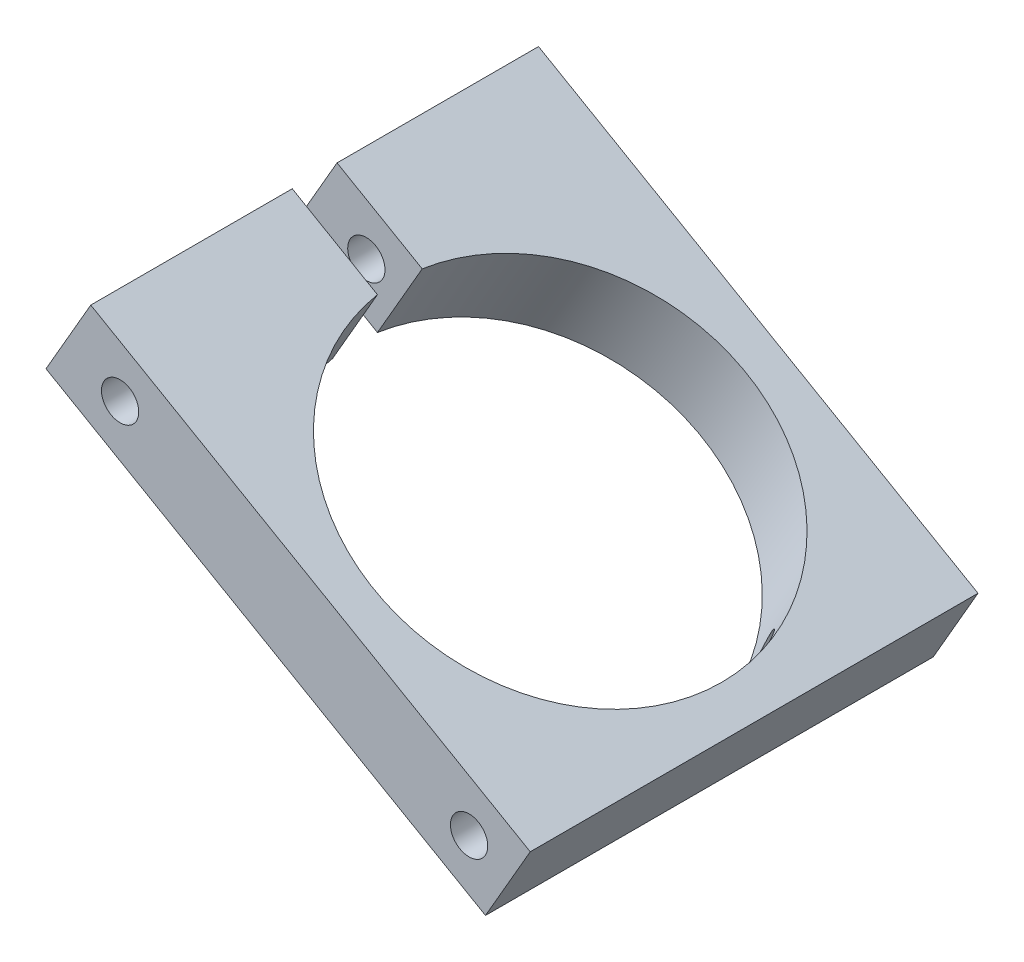
ISO-10303-21;
HEADER;
FILE_DESCRIPTION(('STEP AP214'),'2;1');
FILE_NAME('part.step','',(''),(''),'','','');
FILE_SCHEMA(('AUTOMOTIVE_DESIGN { 1 0 10303 214 1 1 1 1 }'));
ENDSEC;
DATA;
#1=APPLICATION_CONTEXT('core data for automotive mechanical design processes');
#2=APPLICATION_PROTOCOL_DEFINITION('international standard','automotive_design',2000,#1);
#3=PRODUCT_CONTEXT('',#1,'mechanical');
#4=PRODUCT('Part','Part','',(#3));
#5=PRODUCT_RELATED_PRODUCT_CATEGORY('part','',(#4));
#6=PRODUCT_DEFINITION_FORMATION('','',#4);
#7=PRODUCT_DEFINITION_CONTEXT('part definition',#1,'design');
#8=PRODUCT_DEFINITION('design','',#6,#7);
#9=PRODUCT_DEFINITION_SHAPE('','',#8);
#10=(LENGTH_UNIT() NAMED_UNIT(*) SI_UNIT(.MILLI.,.METRE.));
#11=(NAMED_UNIT(*) PLANE_ANGLE_UNIT() SI_UNIT($,.RADIAN.));
#12=(NAMED_UNIT(*) SI_UNIT($,.STERADIAN.) SOLID_ANGLE_UNIT());
#13=UNCERTAINTY_MEASURE_WITH_UNIT(LENGTH_MEASURE(1.E-05),#10,'distance_accuracy_value','');
#14=(GEOMETRIC_REPRESENTATION_CONTEXT(3) GLOBAL_UNCERTAINTY_ASSIGNED_CONTEXT((#13)) GLOBAL_UNIT_ASSIGNED_CONTEXT((#10,
#11,#12)) REPRESENTATION_CONTEXT('',''));
#15=CARTESIAN_POINT('',(0.,0.,0.));
#16=DIRECTION('',(0.,0.,1.));
#17=DIRECTION('',(1.,0.,0.));
#18=AXIS2_PLACEMENT_3D('',#15,#16,#17);
#19=CARTESIAN_POINT('',(28.0096189432352,745.846095396542,-386.357743681072));
#20=DIRECTION('',(0.,0.,-1.));
#21=DIRECTION('',(0.,1.,0.));
#22=AXIS2_PLACEMENT_3D('',#19,#20,#21);
#23=CYLINDRICAL_SURFACE('',#22,1.25);
#24=CARTESIAN_POINT('',(28.0096189432352,745.846095396542,-387.857743681072));
#25=DIRECTION('',(0.,0.,-1.));
#26=DIRECTION('',(0.,1.,0.));
#27=AXIS2_PLACEMENT_3D('',#24,#25,#26);
#28=CIRCLE('',#27,1.25);
#29=CARTESIAN_POINT('',(28.0096189432352,747.096095396542,-387.857743681072));
#30=VERTEX_POINT('',#29);
#31=EDGE_CURVE('E129',#30,#30,#28,.T.);
#32=ORIENTED_EDGE('',*,*,#31,.F.);
#33=EDGE_LOOP('',(#32));
#34=FACE_BOUND('',#33,.T.);
#35=CARTESIAN_POINT('',(28.0096189432352,745.846095396542,-401.357743681072));
#36=DIRECTION('',(0.,0.,-1.));
#37=DIRECTION('',(0.,1.,0.));
#38=AXIS2_PLACEMENT_3D('',#35,#36,#37);
#39=CIRCLE('',#38,1.25);
#40=CARTESIAN_POINT('',(28.0096189432352,747.096095396542,-401.357743681072));
#41=VERTEX_POINT('',#40);
#42=EDGE_CURVE('E147',#41,#41,#39,.T.);
#43=ORIENTED_EDGE('',*,*,#42,.T.);
#44=EDGE_LOOP('',(#43));
#45=FACE_BOUND('',#44,.T.);
#46=ADVANCED_FACE('F17',(#34,#45),#23,.F.);
#47=CARTESIAN_POINT('',(51.3923048454144,732.346095396542,-386.357743681072));
#48=DIRECTION('',(0.,0.,-1.));
#49=DIRECTION('',(0.,1.,0.));
#50=AXIS2_PLACEMENT_3D('',#47,#48,#49);
#51=CYLINDRICAL_SURFACE('',#50,1.25);
#52=CARTESIAN_POINT('',(50.3097730906838,732.971095396542,-392.736419092159));
#53=CARTESIAN_POINT('',(50.2908040262226,732.938235917205,-392.736415954482));
#54=CARTESIAN_POINT('',(50.273330159089,732.904485214798,-392.733481741807));
#55=CARTESIAN_POINT('',(50.2418316327142,732.836326695294,-392.721998875565));
#56=CARTESIAN_POINT('',(50.2278110414257,732.801918154172,-392.713443643528));
#57=CARTESIAN_POINT('',(50.2033676184113,732.733695676567,-392.691473109544));
#58=CARTESIAN_POINT('',(50.1929212543899,732.699879298622,-392.678090836825));
#59=CARTESIAN_POINT('',(50.1752570040864,732.63329443818,-392.647285870886));
#60=CARTESIAN_POINT('',(50.1680400011002,732.600526244655,-392.629862074202));
#61=CARTESIAN_POINT('',(50.1526063630636,732.515165736853,-392.579119477517));
#62=CARTESIAN_POINT('',(50.1468995206476,732.463834403045,-392.542921400855));
#63=CARTESIAN_POINT('',(50.1414884289491,732.365750322363,-392.464366687459));
#64=CARTESIAN_POINT('',(50.1418030900129,732.319012463176,-392.421991063913));
#65=CARTESIAN_POINT('',(50.1465491960324,732.236288379481,-392.33923964225));
#66=CARTESIAN_POINT('',(50.1504006620543,732.199711595686,-392.299408491015));
#67=CARTESIAN_POINT('',(50.1606752196164,732.129670028517,-392.21739040555));
#68=CARTESIAN_POINT('',(50.1671002743988,732.096207645011,-392.175201694063));
#69=CARTESIAN_POINT('',(50.1893504905614,732.000036856364,-392.045880474077));
#70=CARTESIAN_POINT('',(50.2081439611746,731.941618312109,-391.956069829445));
#71=CARTESIAN_POINT('',(50.2509143151324,731.833069467234,-391.769982309983));
#72=CARTESIAN_POINT('',(50.275003232791,731.783167750861,-391.673602763514));
#73=CARTESIAN_POINT('',(50.326063494932,731.69159126648,-391.477666883315));
#74=CARTESIAN_POINT('',(50.3530378586709,731.649925248477,-391.378107299984));
#75=CARTESIAN_POINT('',(50.4085428227335,731.573472289284,-391.176546350132));
#76=CARTESIAN_POINT('',(50.4370770969952,731.538702566738,-391.074539567207));
#77=CARTESIAN_POINT('',(50.4946743862452,731.475121024304,-390.868903153368));
#78=CARTESIAN_POINT('',(50.5237371811703,731.446306783814,-390.76527420028));
#79=CARTESIAN_POINT('',(50.5870357911401,731.388917967908,-390.537516039534));
#80=CARTESIAN_POINT('',(50.6212395950025,731.361362823331,-390.413122917614));
#81=CARTESIAN_POINT('',(50.6885595894194,731.312181401137,-390.162862736095));
#82=CARTESIAN_POINT('',(50.7216754961536,731.290556660052,-390.036995303303));
#83=CARTESIAN_POINT('',(50.7861782880421,731.252240182088,-389.78393576066));
#84=CARTESIAN_POINT('',(50.8175633202645,731.235553651331,-389.656742398107));
#85=CARTESIAN_POINT('',(50.8780256320545,731.206296316347,-389.401332739719));
#86=CARTESIAN_POINT('',(50.907102643708,731.1937259894,-389.273116327026));
#87=CARTESIAN_POINT('',(50.9901516626482,731.161051171564,-388.88718074635));
#88=CARTESIAN_POINT('',(51.0399563406705,731.145975068332,-388.628119188464));
#89=CARTESIAN_POINT('',(51.1252927256141,731.124152056332,-388.10752455301));
#90=CARTESIAN_POINT('',(51.1608350355652,731.117398952257,-387.845993459969));
#91=CARTESIAN_POINT('',(51.2092478260234,731.109389195669,-387.379873878634));
#92=CARTESIAN_POINT('',(51.2254120765776,731.107240675365,-387.175640818064));
#93=CARTESIAN_POINT('',(51.2470291324333,731.104516521096,-386.766852730235));
#94=CARTESIAN_POINT('',(51.2524957193986,731.103938863036,-386.562298457446));
#95=CARTESIAN_POINT('',(51.2524954482708,731.103938441769,-386.148294362564));
#96=CARTESIAN_POINT('',(51.246763847253,731.104543643365,-385.938844516084));
#97=CARTESIAN_POINT('',(51.2241194255486,731.107410117996,-385.52052600228));
#98=CARTESIAN_POINT('',(51.2072043244245,731.109671728801,-385.311657462217));
#99=CARTESIAN_POINT('',(51.1628983108311,731.117121756461,-384.894287188887));
#100=CARTESIAN_POINT('',(51.1354675692097,731.122321337131,-384.685789915798));
#101=CARTESIAN_POINT('',(51.0713182665721,731.137561992826,-384.270439728651));
#102=CARTESIAN_POINT('',(51.0346010941785,731.147602344202,-384.063586573509));
#103=CARTESIAN_POINT('',(50.9531194375939,731.17499613778,-383.650786127465));
#104=CARTESIAN_POINT('',(50.9083124530245,731.192388886731,-383.444849807547));
#105=CARTESIAN_POINT('',(50.8125252236056,731.237416190853,-383.035347622215));
#106=CARTESIAN_POINT('',(50.7615411329433,731.265057148759,-382.831783320938));
#107=CARTESIAN_POINT('',(50.6824010151417,731.316769180559,-382.529666772488));
#108=CARTESIAN_POINT('',(50.6556739318958,731.335632256952,-382.429839224293));
#109=CARTESIAN_POINT('',(50.6016623055785,731.377307213571,-382.231169680477));
#110=CARTESIAN_POINT('',(50.5743778469592,731.400118499431,-382.132327538877));
#111=CARTESIAN_POINT('',(50.5197405521901,731.450269048116,-381.935954464242));
#112=CARTESIAN_POINT('',(50.4923878477724,731.477602494154,-381.838422018587));
#113=CARTESIAN_POINT('',(50.4381748071751,731.53753445755,-381.644865434439));
#114=CARTESIAN_POINT('',(50.4113142864417,731.570130954501,-381.548840732605));
#115=CARTESIAN_POINT('',(50.3723565016814,731.623138591781,-381.407594903611));
#116=CARTESIAN_POINT('',(50.359766184233,731.641203102318,-381.361625675436));
#117=CARTESIAN_POINT('',(50.3350126429696,731.678906438959,-381.270224064769));
#118=CARTESIAN_POINT('',(50.3228494188946,731.698545264103,-381.22479168195));
#119=CARTESIAN_POINT('',(50.2870845311923,731.760208375759,-381.08900017262));
#120=CARTESIAN_POINT('',(50.2643226058779,731.80482834043,-380.999556589137));
#121=CARTESIAN_POINT('',(50.22967565829,731.885649407038,-380.854071291457));
#122=CARTESIAN_POINT('',(50.216723134075,731.919557873822,-380.797008844043));
#123=CARTESIAN_POINT('',(50.1930854818591,731.991403208769,-380.684891357616));
#124=CARTESIAN_POINT('',(50.1824020381856,732.029343038268,-380.629837834749));
#125=CARTESIAN_POINT('',(50.1642250439023,732.109457428058,-380.522877801884));
#126=CARTESIAN_POINT('',(50.1567111555487,732.15160277468,-380.470953118648));
#127=CARTESIAN_POINT('',(50.1459415688226,732.240772038375,-380.37106336145));
#128=CARTESIAN_POINT('',(50.142677167874,732.287785771452,-380.323090384193));
#129=CARTESIAN_POINT('',(50.1420879428935,732.373245230384,-380.2454116554));
#130=CARTESIAN_POINT('',(50.1433617079875,732.410428803642,-380.21434026231));
#131=CARTESIAN_POINT('',(50.1497337575864,732.487569824823,-380.156136231996));
#132=CARTESIAN_POINT('',(50.1548349516082,732.527529361986,-380.129006609947));
#133=CARTESIAN_POINT('',(50.1698268863231,732.610370789272,-380.079785112982));
#134=CARTESIAN_POINT('',(50.1797768083473,732.6532830101,-380.057760582642));
#135=CARTESIAN_POINT('',(50.2053032525146,732.740518563882,-380.021039072498));
#136=CARTESIAN_POINT('',(50.2208605168824,732.784836599307,-380.006317418105));
#137=CARTESIAN_POINT('',(50.2493941227696,732.852988340758,-379.990478000767));
#138=CARTESIAN_POINT('',(50.2603294122553,732.876976678621,-379.98621831707));
#139=CARTESIAN_POINT('',(50.2838506413307,732.924481909237,-379.980512329084));
#140=CARTESIAN_POINT('',(50.2964366484474,732.947998782658,-379.979066139926));
#141=CARTESIAN_POINT('',(50.3287463667694,733.003954117338,-379.979071300343));
#142=CARTESIAN_POINT('',(50.3492385031406,733.035962244251,-379.982005689429));
#143=CARTESIAN_POINT('',(50.3925161341846,733.097319539417,-379.993488795393));
#144=CARTESIAN_POINT('',(50.4153042158502,733.126665635835,-380.002043906784));
#145=CARTESIAN_POINT('',(50.4621644502676,733.181945012753,-380.024014189993));
#146=CARTESIAN_POINT('',(50.4862269682828,733.207899857925,-380.037396388754));
#147=CARTESIAN_POINT('',(50.5350590029837,733.25648998195,-380.068201318226));
#148=CARTESIAN_POINT('',(50.5598287180863,733.279124318021,-380.08562519287));
#149=CARTESIAN_POINT('',(50.6260369061243,733.335171043098,-380.136368272725));
#150=CARTESIAN_POINT('',(50.6676382355432,733.365779297241,-380.172566850274));
#151=CARTESIAN_POINT('',(50.7498759702721,733.41950729109,-380.251121717075));
#152=CARTESIAN_POINT('',(50.7905089644731,733.44260339639,-380.29349684461));
#153=CARTESIAN_POINT('',(50.8645210250433,733.479854108152,-380.376245861508));
#154=CARTESIAN_POINT('',(50.8981215816472,733.494806416672,-380.416075004242));
#155=CARTESIAN_POINT('',(50.9639135685092,733.520928267751,-380.498088865034));
#156=CARTESIAN_POINT('',(50.9961039026989,733.532094911854,-380.540275359321));
#157=CARTESIAN_POINT('',(51.0905173112479,733.560912445743,-380.669598135095));
#158=CARTESIAN_POINT('',(51.1505090556011,733.573846930296,-380.759413054181));
#159=CARTESIAN_POINT('',(51.2659138347619,733.591083165647,-380.945522413983));
#160=CARTESIAN_POINT('',(51.3211840690644,733.595172323004,-381.041920146693));
#161=CARTESIAN_POINT('',(51.4260387493256,733.596738898882,-381.237892890135));
#162=CARTESIAN_POINT('',(51.4756171502067,733.594209354519,-381.337471137941));
#163=CARTESIAN_POINT('',(51.5695755018387,733.584363653438,-381.539032702268));
#164=CARTESIAN_POINT('',(51.6139443393595,733.577037475562,-381.641020622149));
#165=CARTESIAN_POINT('',(51.697789278315,733.55894961999,-381.846620245664));
#166=CARTESIAN_POINT('',(51.7372672888067,733.548189288664,-381.950231297833));
#167=CARTESIAN_POINT('',(51.8185811006875,733.522076936545,-382.17788961091));
#168=CARTESIAN_POINT('',(51.8595214123846,733.506244727356,-382.302199793624));
#169=CARTESIAN_POINT('',(51.9357307841083,733.472559658916,-382.552292242471));
#170=CARTESIAN_POINT('',(51.9709983813328,733.454706280488,-382.678074879359));
#171=CARTESIAN_POINT('',(52.0364006762261,733.418031729661,-382.930953895139));
#172=CARTESIAN_POINT('',(52.0665303338729,733.399209630289,-383.058051435751));
#173=CARTESIAN_POINT('',(52.1220775141603,733.36150459123,-383.313268281299));
#174=CARTESIAN_POINT('',(52.1474944971605,733.342621644826,-383.441387701498));
#175=CARTESIAN_POINT('',(52.2173607519228,733.287023547351,-383.827362126641));
#176=CARTESIAN_POINT('',(52.255357051842,733.251401948829,-384.086561571914));
#177=CARTESIAN_POINT('',(52.3169933406066,733.188353772769,-384.607521193496));
#178=CARTESIAN_POINT('',(52.3406397655532,733.160923524115,-384.869280168214));
#179=CARTESIAN_POINT('',(52.3685720370257,733.12690189637,-385.287386094103));
#180=CARTESIAN_POINT('',(52.3768207247738,733.116374497387,-385.443161407016));
#181=CARTESIAN_POINT('',(52.389333833761,733.100112834645,-385.755131046196));
#182=CARTESIAN_POINT('',(52.3935981930284,733.09437864544,-385.911325378941));
#183=CARTESIAN_POINT('',(52.3983120673214,733.08802838141,-386.223906715577));
#184=CARTESIAN_POINT('',(52.3987608207344,733.087413328388,-386.380293751703));
#185=CARTESIAN_POINT('',(52.3958588627739,733.091337194759,-386.692965774248));
#186=CARTESIAN_POINT('',(52.3925081933617,733.09587605723,-386.849250761775));
#187=CARTESIAN_POINT('',(52.3818842001704,733.109842006402,-387.161202639929));
#188=CARTESIAN_POINT('',(52.374617480582,733.11926086225,-387.316870127971));
#189=CARTESIAN_POINT('',(52.3558960393624,733.142470719785,-387.627630114727));
#190=CARTESIAN_POINT('',(52.3444411482592,733.156261898392,-387.782722589917));
#191=CARTESIAN_POINT('',(52.3169610813404,733.187488692818,-388.092087801965));
#192=CARTESIAN_POINT('',(52.3009371717394,733.204923298573,-388.24636075389));
#193=CARTESIAN_POINT('',(52.2638376233472,733.242548726047,-388.553945229171));
#194=CARTESIAN_POINT('',(52.2427625286832,733.26273925079,-388.707256854259));
#195=CARTESIAN_POINT('',(52.2017709434418,733.298872561339,-388.969429208506));
#196=CARTESIAN_POINT('',(52.18322173129,733.314395562002,-389.078562324955));
#197=CARTESIAN_POINT('',(52.1430107255694,733.345890566208,-389.296165819673));
#198=CARTESIAN_POINT('',(52.1213493887508,733.361862503586,-389.404636292764));
#199=CARTESIAN_POINT('',(52.051251087349,733.409825551329,-389.729294759831));
#200=CARTESIAN_POINT('',(51.9977435949169,733.441821814024,-389.944441170726));
#201=CARTESIAN_POINT('',(51.8999911725837,733.489061561647,-390.283773312813));
#202=CARTESIAN_POINT('',(51.8608818560416,733.505811867676,-390.409238007982));
#203=CARTESIAN_POINT('',(51.7765540042981,733.53641882319,-390.658443682761));
#204=CARTESIAN_POINT('',(51.7313373452478,733.550276358009,-390.782185178903));
#205=CARTESIAN_POINT('',(51.6342993657971,733.57345872159,-391.027060577143));
#206=CARTESIAN_POINT('',(51.5824991420564,733.582797589753,-391.148201423693));
#207=CARTESIAN_POINT('',(51.4715014189362,733.5948365315,-391.387333716645));
#208=CARTESIAN_POINT('',(51.4123119257463,733.597543725933,-391.505328406448));
#209=CARTESIAN_POINT('',(51.3082068286248,733.593928389086,-391.69565292649));
#210=CARTESIAN_POINT('',(51.2656752408921,733.590468157817,-391.769334634445));
#211=CARTESIAN_POINT('',(51.1769485409396,733.578221303705,-391.91417977245));
#212=CARTESIAN_POINT('',(51.130749154991,733.569428385626,-391.985340120788));
#213=CARTESIAN_POINT('',(51.0342870846962,733.544771686167,-392.124417879132));
#214=CARTESIAN_POINT('',(50.983997265539,733.528856889811,-392.192307906017));
#215=CARTESIAN_POINT('',(50.8798511468399,733.487596939209,-392.322241559135));
#216=CARTESIAN_POINT('',(50.8260045731316,733.462276692268,-392.384300089148));
#217=CARTESIAN_POINT('',(50.7397878316849,733.412863712839,-392.473973059982));
#218=CARTESIAN_POINT('',(50.7083087021021,733.393064383115,-392.504793571013));
#219=CARTESIAN_POINT('',(50.6448903647995,733.34877604681,-392.562471875909));
#220=CARTESIAN_POINT('',(50.6129509133617,733.324284464728,-392.589327479102));
#221=CARTESIAN_POINT('',(50.5489648657028,733.269711979905,-392.637985922235));
#222=CARTESIAN_POINT('',(50.5169220345165,733.239564224961,-392.659720470505));
#223=CARTESIAN_POINT('',(50.4544651226643,733.173737889026,-392.695856818428));
#224=CARTESIAN_POINT('',(50.4240457828089,733.13807883546,-392.710283766546));
#225=CARTESIAN_POINT('',(50.3799324550577,733.079754105891,-392.725572200946));
#226=CARTESIAN_POINT('',(50.3650534324429,733.058782728135,-392.729622326244));
#227=CARTESIAN_POINT('',(50.336473186931,733.015712270729,-392.735046964607));
#228=CARTESIAN_POINT('',(50.3227720677351,732.993613092061,-392.736421242322));
#229=CARTESIAN_POINT('',(50.3097730906838,732.971095396542,-392.736419092159));
#230=B_SPLINE_CURVE_WITH_KNOTS('',3,(#52,#53,#54,#55,#56,#57,#58,#59,#60,#61,#62,#63,#64,#65,
#66,#67,#68,#69,#70,#71,#72,#73,#74,#75,#76,#77,#78,#79,#80,#81,#82,#83,#84,#85,#86,#87,#88,#89,
#90,#91,#92,#93,#94,#95,#96,#97,#98,#99,#100,#101,#102,#103,#104,#105,#106,#107,#108,#109,#110,
#111,#112,#113,#114,#115,#116,#117,#118,#119,#120,#121,#122,#123,#124,#125,#126,#127,#128,#129,
#130,#131,#132,#133,#134,#135,#136,#137,#138,#139,#140,#141,#142,#143,#144,#145,#146,#147,#148,
#149,#150,#151,#152,#153,#154,#155,#156,#157,#158,#159,#160,#161,#162,#163,#164,#165,#166,#167,
#168,#169,#170,#171,#172,#173,#174,#175,#176,#177,#178,#179,#180,#181,#182,#183,#184,#185,#186,
#187,#188,#189,#190,#191,#192,#193,#194,#195,#196,#197,#198,#199,#200,#201,#202,#203,#204,#205,
#206,#207,#208,#209,#210,#211,#212,#213,#214,#215,#216,#217,#218,#219,#220,#221,#222,#223,#224,
#225,#226,#227,#228,#229),.UNSPECIFIED.,.T.,.F.,(4,2,2,2,2,2,2,2,2,2,2,2,2,2,2,2,2,2,2,2,2,2,2,
2,2,2,2,2,2,2,2,2,2,2,2,2,2,2,2,2,2,2,2,2,2,2,2,2,2,2,2,2,2,2,2,2,2,2,2,2,2,2,2,2,2,2,2,2,2,2,2,
2,2,2,2,2,2,2,2,2,2,2,2,2,2,2,2,2,4),(0.,0.113721890322083,0.227577110903364,0.340667608492556,
0.453789019754609,0.641912274934512,0.830626422083839,0.993034505980116,1.15556671828809,
1.48094764319011,1.81402066107279,2.14744567179903,2.48169297742483,2.81580416014831,
3.21138556181352,3.60706935960338,4.00316883416764,4.39931422075789,5.19142999367798,
5.9829557904695,6.59733783395388,7.21092785445229,7.83919972331039,8.46759974317119,
9.09840379712675,9.72911358112181,10.3632387257247,10.9977607197244,11.3128502480879,
11.6278923838029,11.9425323919418,12.2570519003819,12.4099373098447,12.5628226262352,
12.8699456203739,13.0726891086883,13.2755825705661,13.4771535795327,13.6783111360114,
13.8234251775968,13.9686496432024,14.1156928119748,14.2622357159932,14.3421696291208,
14.4221068131788,14.5358305661664,14.6496839235358,14.7627738543601,14.8758958326369,
15.0640213961694,15.2527332326062,15.4151334377539,15.5776577036956,15.9030544333854,
16.2361888414633,16.5696738482169,16.903857806856,17.2379109083162,17.6332305486911,
18.0286519658391,18.4244590647212,18.8203114588512,19.6128646814046,20.4050621705431,
20.8739969727831,21.342939068652,21.8119747653609,22.281005282042,22.7492472701312,
23.2175082074657,23.6856395013169,24.153720389464,24.489018395207,24.8242672411877,
25.4956485398597,25.8929566697983,26.2901430246848,26.6860872769586,27.0816061920189,
27.3368315385945,27.5923587667445,27.8497464209372,28.1064572705275,28.2510537321627,
28.3957297889451,28.5422379338904,28.6882383986859,28.7661620224381,28.8440924994809),.UNSPECIFIED.);
#231=CARTESIAN_POINT('',(50.3097730906838,732.971095396542,-392.736419092159));
#232=VERTEX_POINT('',#231);
#233=EDGE_CURVE('E88',#232,#232,#230,.T.);
#234=ORIENTED_EDGE('',*,*,#233,.T.);
#235=EDGE_LOOP('',(#234));
#236=FACE_BOUND('',#235,.T.);
#237=CARTESIAN_POINT('',(51.3923048454144,732.346095396542,-401.357743681072));
#238=DIRECTION('',(0.,0.,-1.));
#239=DIRECTION('',(0.,1.,0.));
#240=AXIS2_PLACEMENT_3D('',#237,#238,#239);
#241=CIRCLE('',#240,1.25);
#242=CARTESIAN_POINT('',(51.3923048454144,733.596095396542,-401.357743681072));
#243=VERTEX_POINT('',#242);
#244=EDGE_CURVE('E144',#243,#243,#241,.T.);
#245=ORIENTED_EDGE('',*,*,#244,.T.);
#246=EDGE_LOOP('',(#245));
#247=FACE_BOUND('',#246,.T.);
#248=CARTESIAN_POINT('',(51.3923048454144,732.346095396542,-371.357743681072));
#249=DIRECTION('',(0.,0.,-1.));
#250=DIRECTION('',(0.,1.,0.));
#251=AXIS2_PLACEMENT_3D('',#248,#249,#250);
#252=CIRCLE('',#251,1.25);
#253=CARTESIAN_POINT('',(51.3923048454144,733.596095396542,-371.357743681072));
#254=VERTEX_POINT('',#253);
#255=EDGE_CURVE('E139',#254,#254,#252,.F.);
#256=ORIENTED_EDGE('',*,*,#255,.T.);
#257=EDGE_LOOP('',(#256));
#258=FACE_BOUND('',#257,.T.);
#259=ADVANCED_FACE('F156',(#236,#247,#258),#51,.F.);
#260=CARTESIAN_POINT('',(23.0455173280971,745.248019185189,-371.357743681072));
#261=DIRECTION('',(-0.500000000000001,-0.866025403784438,0.));
#262=DIRECTION('',(0.866025403784438,-0.500000000000001,0.));
#263=AXIS2_PLACEMENT_3D('',#260,#261,#262);
#264=PLANE('',#263);
#265=DIRECTION('',(-0.866025403784439,0.499999999999999,0.));
#266=VECTOR('',#265,1.);
#267=CARTESIAN_POINT('',(52.490381056768,728.248019185189,-371.357743681072));
#268=LINE('',#267,#266);
#269=CARTESIAN_POINT('',(52.4903810567681,728.248019185189,-371.357743681072));
#270=VERTEX_POINT('',#269);
#271=CARTESIAN_POINT('',(23.045517328097,745.248019185189,-371.357743681072));
#272=VERTEX_POINT('',#271);
#273=EDGE_CURVE('E109',#270,#272,#268,.T.);
#274=ORIENTED_EDGE('',*,*,#273,.T.);
#275=DIRECTION('',(0.,0.,1.));
#276=VECTOR('',#275,1.);
#277=CARTESIAN_POINT('',(23.045517328097,745.248019185189,-384.857743681072));
#278=LINE('',#277,#276);
#279=CARTESIAN_POINT('',(23.045517328097,745.248019185189,-384.857743681072));
#280=VERTEX_POINT('',#279);
#281=EDGE_CURVE('E94',#272,#280,#278,.F.);
#282=ORIENTED_EDGE('',*,*,#281,.T.);
#283=DIRECTION('',(-0.866025403784399,0.500000000000069,0.));
#284=VECTOR('',#283,1.);
#285=CARTESIAN_POINT('',(28.7529073698988,741.952856008184,-384.857743681072));
#286=LINE('',#285,#284);
#287=CARTESIAN_POINT('',(28.7529073698991,741.952856008184,-384.857743681072));
#288=VERTEX_POINT('',#287);
#289=EDGE_CURVE('E90',#288,#280,#286,.T.);
#290=ORIENTED_EDGE('',*,*,#289,.F.);
#291=CARTESIAN_POINT('',(39.5000000000013,735.748019185188,-386.357743681072));
#292=DIRECTION('',(0.5,0.866025403784439,0.));
#293=DIRECTION('',(-0.866025403784439,0.5,0.));
#294=AXIS2_PLACEMENT_3D('',#291,#292,#293);
#295=CIRCLE('',#294,12.5);
#296=CARTESIAN_POINT('',(28.7529073698991,741.952856008184,-387.857743681072));
#297=VERTEX_POINT('',#296);
#298=EDGE_CURVE('E20',#288,#297,#295,.T.);
#299=ORIENTED_EDGE('',*,*,#298,.T.);
#300=DIRECTION('',(0.866025403784399,-0.500000000000069,0.));
#301=VECTOR('',#300,1.);
#302=CARTESIAN_POINT('',(23.045517328097,745.248019185189,-387.857743681072));
#303=LINE('',#302,#301);
#304=CARTESIAN_POINT('',(23.045517328097,745.248019185189,-387.857743681072));
#305=VERTEX_POINT('',#304);
#306=EDGE_CURVE('E132',#305,#297,#303,.T.);
#307=ORIENTED_EDGE('',*,*,#306,.F.);
#308=DIRECTION('',(0.,0.,1.));
#309=VECTOR('',#308,1.);
#310=CARTESIAN_POINT('',(23.045517328097,745.248019185189,-401.357743681072));
#311=LINE('',#310,#309);
#312=CARTESIAN_POINT('',(23.045517328097,745.248019185189,-401.357743681072));
#313=VERTEX_POINT('',#312);
#314=EDGE_CURVE('E126',#305,#313,#311,.F.);
#315=ORIENTED_EDGE('',*,*,#314,.T.);
#316=DIRECTION('',(0.866025403784439,-0.499999999999999,0.));
#317=VECTOR('',#316,1.);
#318=CARTESIAN_POINT('',(23.045517328097,745.248019185189,-401.357743681072));
#319=LINE('',#318,#317);
#320=CARTESIAN_POINT('',(52.4903810567681,728.248019185189,-401.357743681072));
#321=VERTEX_POINT('',#320);
#322=EDGE_CURVE('E120',#313,#321,#319,.T.);
#323=ORIENTED_EDGE('',*,*,#322,.T.);
#324=DIRECTION('',(0.,0.,1.));
#325=VECTOR('',#324,1.);
#326=CARTESIAN_POINT('',(52.4903810567682,728.248019185189,-401.357743681072));
#327=LINE('',#326,#325);
#328=EDGE_CURVE('E115',#321,#270,#327,.T.);
#329=ORIENTED_EDGE('',*,*,#328,.T.);
#330=EDGE_LOOP('',(#274,#282,#290,#299,#307,#315,#323,#329));
#331=FACE_BOUND('',#330,.T.);
#332=ADVANCED_FACE('F92',(#331),#264,.T.);
#333=CARTESIAN_POINT('',(28.0096189432352,745.846095396542,-386.357743681072));
#334=DIRECTION('',(0.,0.,-1.));
#335=DIRECTION('',(0.,1.,0.));
#336=AXIS2_PLACEMENT_3D('',#333,#334,#335);
#337=CYLINDRICAL_SURFACE('',#336,1.25);
#338=CARTESIAN_POINT('',(28.0096189432352,745.846095396542,-371.357743681072));
#339=DIRECTION('',(0.,0.,-1.));
#340=DIRECTION('',(0.,1.,0.));
#341=AXIS2_PLACEMENT_3D('',#338,#339,#340);
#342=CIRCLE('',#341,1.25);
#343=CARTESIAN_POINT('',(28.0096189432352,747.096095396542,-371.357743681072));
#344=VERTEX_POINT('',#343);
#345=EDGE_CURVE('E111',#344,#344,#342,.F.);
#346=ORIENTED_EDGE('',*,*,#345,.T.);
#347=EDGE_LOOP('',(#346));
#348=FACE_BOUND('',#347,.T.);
#349=CARTESIAN_POINT('',(28.0096189432352,745.846095396542,-384.857743681072));
#350=DIRECTION('',(0.,0.,-1.));
#351=DIRECTION('',(0.,1.,0.));
#352=AXIS2_PLACEMENT_3D('',#349,#350,#351);
#353=CIRCLE('',#352,1.25);
#354=CARTESIAN_POINT('',(28.0096189432352,747.096095396542,-384.857743681072));
#355=VERTEX_POINT('',#354);
#356=EDGE_CURVE('E95',#355,#355,#353,.F.);
#357=ORIENTED_EDGE('',*,*,#356,.F.);
#358=EDGE_LOOP('',(#357));
#359=FACE_BOUND('',#358,.T.);
#360=ADVANCED_FACE('F164',(#348,#359),#337,.F.);
#361=CARTESIAN_POINT('',(41.0000000000014,738.346095396542,-386.357743681072));
#362=DIRECTION('',(0.5,0.866025403784439,0.));
#363=DIRECTION('',(-0.866025403784439,0.5,0.));
#364=AXIS2_PLACEMENT_3D('',#361,#362,#363);
#365=CYLINDRICAL_SURFACE('',#364,12.5);
#366=ORIENTED_EDGE('',*,*,#233,.F.);
#367=EDGE_LOOP('',(#366));
#368=FACE_BOUND('',#367,.T.);
#369=CARTESIAN_POINT('',(42.5000000000015,740.944171607895,-386.357743681072));
#370=DIRECTION('',(0.5,0.866025403784439,0.));
#371=DIRECTION('',(-0.866025403784439,0.5,0.));
#372=AXIS2_PLACEMENT_3D('',#369,#370,#371);
#373=CIRCLE('',#372,12.5);
#374=CARTESIAN_POINT('',(31.7529073698989,747.149008430891,-384.857743681072));
#375=VERTEX_POINT('',#374);
#376=CARTESIAN_POINT('',(31.7529073698989,747.149008430891,-387.857743681072));
#377=VERTEX_POINT('',#376);
#378=EDGE_CURVE('E98',#375,#377,#373,.T.);
#379=ORIENTED_EDGE('',*,*,#378,.T.);
#380=DIRECTION('',(0.499999999999975,0.866025403784453,0.));
#381=VECTOR('',#380,1.);
#382=CARTESIAN_POINT('',(28.7529073698988,741.952856008184,-387.857743681072));
#383=LINE('',#382,#381);
#384=EDGE_CURVE('E84',#297,#377,#383,.T.);
#385=ORIENTED_EDGE('',*,*,#384,.F.);
#386=ORIENTED_EDGE('',*,*,#298,.F.);
#387=DIRECTION('',(-0.499999999999975,-0.866025403784453,0.));
#388=VECTOR('',#387,1.);
#389=CARTESIAN_POINT('',(31.7529073698988,747.149008430891,-384.857743681072));
#390=LINE('',#389,#388);
#391=EDGE_CURVE('E83',#375,#288,#390,.T.);
#392=ORIENTED_EDGE('',*,*,#391,.F.);
#393=EDGE_LOOP('',(#379,#385,#386,#392));
#394=FACE_BOUND('',#393,.T.);
#395=ADVANCED_FACE('F82',(#368,#394),#365,.F.);
#396=CARTESIAN_POINT('',(26.7105808375582,746.596095396542,-387.857743681072));
#397=DIRECTION('',(0.,0.,1.));
#398=DIRECTION('',(1.,0.,0.));
#399=AXIS2_PLACEMENT_3D('',#396,#397,#398);
#400=PLANE('',#399);
#401=ORIENTED_EDGE('',*,*,#31,.T.);
#402=EDGE_LOOP('',(#401));
#403=FACE_BOUND('',#402,.T.);
#404=ORIENTED_EDGE('',*,*,#384,.T.);
#405=DIRECTION('',(0.866025403784438,-0.500000000000002,0.));
#406=VECTOR('',#405,1.);
#407=CARTESIAN_POINT('',(26.0455173280969,750.444171607895,-387.857743681072));
#408=LINE('',#407,#406);
#409=CARTESIAN_POINT('',(26.0455173280969,750.444171607895,-387.857743681072));
#410=VERTEX_POINT('',#409);
#411=EDGE_CURVE('E137',#377,#410,#408,.F.);
#412=ORIENTED_EDGE('',*,*,#411,.T.);
#413=DIRECTION('',(0.499999999999999,0.866025403784439,0.));
#414=VECTOR('',#413,1.);
#415=CARTESIAN_POINT('',(23.045517328097,745.248019185189,-387.857743681072));
#416=LINE('',#415,#414);
#417=EDGE_CURVE('E123',#410,#305,#416,.F.);
#418=ORIENTED_EDGE('',*,*,#417,.T.);
#419=ORIENTED_EDGE('',*,*,#306,.T.);
#420=EDGE_LOOP('',(#404,#412,#418,#419));
#421=FACE_BOUND('',#420,.T.);
#422=ADVANCED_FACE('F163',(#403,#421),#400,.T.);
#423=CARTESIAN_POINT('',(23.045517328097,745.248019185189,-401.357743681072));
#424=DIRECTION('',(0.866025403784439,-0.499999999999999,0.));
#425=DIRECTION('',(0.499999999999999,0.866025403784439,0.));
#426=AXIS2_PLACEMENT_3D('',#423,#424,#425);
#427=PLANE('',#426);
#428=DIRECTION('',(0.,0.,1.));
#429=VECTOR('',#428,1.);
#430=CARTESIAN_POINT('',(26.045517328097,750.444171607895,-371.357743681072));
#431=LINE('',#430,#429);
#432=CARTESIAN_POINT('',(26.045517328097,750.444171607895,-401.357743681072));
#433=VERTEX_POINT('',#432);
#434=EDGE_CURVE('E211',#410,#433,#431,.F.);
#435=ORIENTED_EDGE('',*,*,#434,.T.);
#436=DIRECTION('',(-0.500000000000046,-0.866025403784412,0.));
#437=VECTOR('',#436,1.);
#438=CARTESIAN_POINT('',(26.045517328097,750.444171607895,-401.357743681072));
#439=LINE('',#438,#437);
#440=EDGE_CURVE('E122',#433,#313,#439,.T.);
#441=ORIENTED_EDGE('',*,*,#440,.T.);
#442=ORIENTED_EDGE('',*,*,#314,.F.);
#443=ORIENTED_EDGE('',*,*,#417,.F.);
#444=EDGE_LOOP('',(#435,#441,#442,#443));
#445=FACE_BOUND('',#444,.T.);
#446=ADVANCED_FACE('F200',(#445),#427,.F.);
#447=CARTESIAN_POINT('',(31.1567332602648,764.493209713572,-401.357743681072));
#448=DIRECTION('',(0.,0.,1.));
#449=DIRECTION('',(1.,0.,0.));
#450=AXIS2_PLACEMENT_3D('',#447,#448,#449);
#451=PLANE('',#450);
#452=ORIENTED_EDGE('',*,*,#244,.F.);
#453=EDGE_LOOP('',(#452));
#454=FACE_BOUND('',#453,.T.);
#455=ORIENTED_EDGE('',*,*,#42,.F.);
#456=EDGE_LOOP('',(#455));
#457=FACE_BOUND('',#456,.T.);
#458=DIRECTION('',(0.866025403784438,-0.500000000000002,0.));
#459=VECTOR('',#458,1.);
#460=CARTESIAN_POINT('',(26.0455173280969,750.444171607895,-401.357743681072));
#461=LINE('',#460,#459);
#462=CARTESIAN_POINT('',(55.4903810567679,733.444171607895,-401.357743681072));
#463=VERTEX_POINT('',#462);
#464=EDGE_CURVE('E216',#433,#463,#461,.T.);
#465=ORIENTED_EDGE('',*,*,#464,.T.);
#466=DIRECTION('',(-0.499999999999999,-0.866025403784439,0.));
#467=VECTOR('',#466,1.);
#468=CARTESIAN_POINT('',(55.4903810567679,733.444171607895,-401.357743681072));
#469=LINE('',#468,#467);
#470=EDGE_CURVE('E117',#463,#321,#469,.T.);
#471=ORIENTED_EDGE('',*,*,#470,.T.);
#472=ORIENTED_EDGE('',*,*,#322,.F.);
#473=ORIENTED_EDGE('',*,*,#440,.F.);
#474=EDGE_LOOP('',(#465,#471,#472,#473));
#475=FACE_BOUND('',#474,.T.);
#476=ADVANCED_FACE('F197',(#454,#457,#475),#451,.F.);
#477=CARTESIAN_POINT('',(55.4903810567679,733.444171607895,-401.357743681072));
#478=DIRECTION('',(-0.866025403784439,0.499999999999999,0.));
#479=DIRECTION('',(-0.499999999999999,-0.866025403784439,0.));
#480=AXIS2_PLACEMENT_3D('',#477,#478,#479);
#481=PLANE('',#480);
#482=ORIENTED_EDGE('',*,*,#328,.F.);
#483=ORIENTED_EDGE('',*,*,#470,.F.);
#484=DIRECTION('',(0.,0.,1.));
#485=VECTOR('',#484,1.);
#486=CARTESIAN_POINT('',(55.4903810567679,733.444171607895,-371.357743681072));
#487=LINE('',#486,#485);
#488=CARTESIAN_POINT('',(55.4903810567679,733.444171607895,-371.357743681072));
#489=VERTEX_POINT('',#488);
#490=EDGE_CURVE('E219',#463,#489,#487,.T.);
#491=ORIENTED_EDGE('',*,*,#490,.T.);
#492=DIRECTION('',(-0.500000000000047,-0.866025403784412,0.));
#493=VECTOR('',#492,1.);
#494=CARTESIAN_POINT('',(55.490381056768,733.444171607895,-371.357743681072));
#495=LINE('',#494,#493);
#496=EDGE_CURVE('E112',#489,#270,#495,.T.);
#497=ORIENTED_EDGE('',*,*,#496,.T.);
#498=EDGE_LOOP('',(#482,#483,#491,#497));
#499=FACE_BOUND('',#498,.T.);
#500=ADVANCED_FACE('F193',(#499),#481,.F.);
#501=CARTESIAN_POINT('',(13.4343013959294,733.797057290865,-371.357743681072));
#502=DIRECTION('',(0.,0.,-1.));
#503=DIRECTION('',(-1.,0.,0.));
#504=AXIS2_PLACEMENT_3D('',#501,#502,#503);
#505=PLANE('',#504);
#506=ORIENTED_EDGE('',*,*,#255,.F.);
#507=EDGE_LOOP('',(#506));
#508=FACE_BOUND('',#507,.T.);
#509=ORIENTED_EDGE('',*,*,#345,.F.);
#510=EDGE_LOOP('',(#509));
#511=FACE_BOUND('',#510,.T.);
#512=ORIENTED_EDGE('',*,*,#273,.F.);
#513=ORIENTED_EDGE('',*,*,#496,.F.);
#514=DIRECTION('',(0.866025403784438,-0.500000000000002,0.));
#515=VECTOR('',#514,1.);
#516=CARTESIAN_POINT('',(26.0455173280969,750.444171607895,-371.357743681072));
#517=LINE('',#516,#515);
#518=CARTESIAN_POINT('',(26.0455173280969,750.444171607895,-371.357743681072));
#519=VERTEX_POINT('',#518);
#520=EDGE_CURVE('E234',#489,#519,#517,.F.);
#521=ORIENTED_EDGE('',*,*,#520,.T.);
#522=DIRECTION('',(0.499999999999999,0.866025403784439,0.));
#523=VECTOR('',#522,1.);
#524=CARTESIAN_POINT('',(23.045517328097,745.248019185189,-371.357743681072));
#525=LINE('',#524,#523);
#526=EDGE_CURVE('E106',#519,#272,#525,.F.);
#527=ORIENTED_EDGE('',*,*,#526,.T.);
#528=EDGE_LOOP('',(#512,#513,#521,#527));
#529=FACE_BOUND('',#528,.T.);
#530=ADVANCED_FACE('F189',(#508,#511,#529),#505,.F.);
#531=CARTESIAN_POINT('',(23.045517328097,745.248019185189,-384.857743681072));
#532=DIRECTION('',(0.866025403784439,-0.499999999999999,0.));
#533=DIRECTION('',(0.499999999999999,0.866025403784439,0.));
#534=AXIS2_PLACEMENT_3D('',#531,#532,#533);
#535=PLANE('',#534);
#536=ORIENTED_EDGE('',*,*,#281,.F.);
#537=ORIENTED_EDGE('',*,*,#526,.F.);
#538=DIRECTION('',(0.,0.,1.));
#539=VECTOR('',#538,1.);
#540=CARTESIAN_POINT('',(26.045517328097,750.444171607895,-371.357743681072));
#541=LINE('',#540,#539);
#542=CARTESIAN_POINT('',(26.045517328097,750.444171607895,-384.857743681072));
#543=VERTEX_POINT('',#542);
#544=EDGE_CURVE('E26',#519,#543,#541,.F.);
#545=ORIENTED_EDGE('',*,*,#544,.T.);
#546=DIRECTION('',(0.500000000000046,0.866025403784412,0.));
#547=VECTOR('',#546,1.);
#548=CARTESIAN_POINT('',(23.045517328097,745.248019185189,-384.857743681072));
#549=LINE('',#548,#547);
#550=EDGE_CURVE('E34',#280,#543,#549,.T.);
#551=ORIENTED_EDGE('',*,*,#550,.F.);
#552=EDGE_LOOP('',(#536,#537,#545,#551));
#553=FACE_BOUND('',#552,.T.);
#554=ADVANCED_FACE('F182',(#553),#535,.F.);
#555=CARTESIAN_POINT('',(26.7105808375582,746.596095396542,-384.857743681072));
#556=DIRECTION('',(0.,0.,-1.));
#557=DIRECTION('',(-1.,0.,0.));
#558=AXIS2_PLACEMENT_3D('',#555,#556,#557);
#559=PLANE('',#558);
#560=ORIENTED_EDGE('',*,*,#356,.T.);
#561=EDGE_LOOP('',(#560));
#562=FACE_BOUND('',#561,.T.);
#563=ORIENTED_EDGE('',*,*,#391,.T.);
#564=ORIENTED_EDGE('',*,*,#289,.T.);
#565=ORIENTED_EDGE('',*,*,#550,.T.);
#566=DIRECTION('',(0.866025403784438,-0.500000000000002,0.));
#567=VECTOR('',#566,1.);
#568=CARTESIAN_POINT('',(26.0455173280969,750.444171607895,-384.857743681072));
#569=LINE('',#568,#567);
#570=EDGE_CURVE('E11',#543,#375,#569,.T.);
#571=ORIENTED_EDGE('',*,*,#570,.T.);
#572=EDGE_LOOP('',(#563,#564,#565,#571));
#573=FACE_BOUND('',#572,.T.);
#574=ADVANCED_FACE('F89',(#562,#573),#559,.T.);
#575=CARTESIAN_POINT('',(26.0455173280969,750.444171607895,-371.357743681072));
#576=DIRECTION('',(-0.500000000000002,-0.866025403784438,0.));
#577=DIRECTION('',(0.866025403784438,-0.500000000000002,0.));
#578=AXIS2_PLACEMENT_3D('',#575,#576,#577);
#579=PLANE('',#578);
#580=ORIENTED_EDGE('',*,*,#544,.F.);
#581=ORIENTED_EDGE('',*,*,#520,.F.);
#582=ORIENTED_EDGE('',*,*,#490,.F.);
#583=ORIENTED_EDGE('',*,*,#464,.F.);
#584=ORIENTED_EDGE('',*,*,#434,.F.);
#585=ORIENTED_EDGE('',*,*,#411,.F.);
#586=ORIENTED_EDGE('',*,*,#378,.F.);
#587=ORIENTED_EDGE('',*,*,#570,.F.);
#588=EDGE_LOOP('',(#580,#581,#582,#583,#584,#585,#586,#587));
#589=FACE_BOUND('',#588,.T.);
#590=ADVANCED_FACE('F175',(#589),#579,.F.);
#591=CLOSED_SHELL('',(#46,#259,#332,#360,#395,#422,#446,#476,#500,#530,#554,#574,#590));
#592=MANIFOLD_SOLID_BREP('B1',#591);
#593=ADVANCED_BREP_SHAPE_REPRESENTATION('',(#18,#592),#14);
#594=SHAPE_DEFINITION_REPRESENTATION(#9,#593);
ENDSEC;
END-ISO-10303-21;
